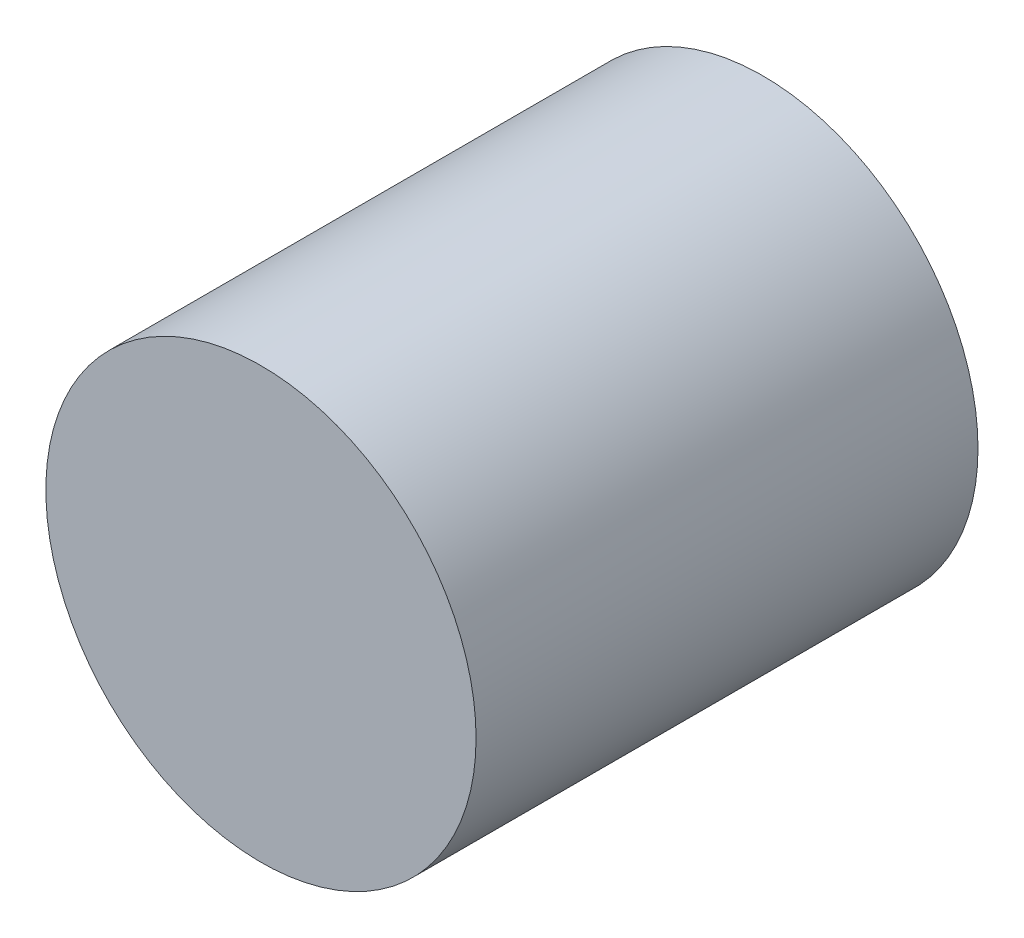
ISO-10303-21;
HEADER;
FILE_DESCRIPTION(('STEP AP214'),'2;1');
FILE_NAME('part.step','',(''),(''),'','','');
FILE_SCHEMA(('AUTOMOTIVE_DESIGN { 1 0 10303 214 1 1 1 1 }'));
ENDSEC;
DATA;
#1=APPLICATION_CONTEXT('core data for automotive mechanical design processes');
#2=APPLICATION_PROTOCOL_DEFINITION('international standard','automotive_design',2000,#1);
#3=PRODUCT_CONTEXT('',#1,'mechanical');
#4=PRODUCT('Part','Part','',(#3));
#5=PRODUCT_RELATED_PRODUCT_CATEGORY('part','',(#4));
#6=PRODUCT_DEFINITION_FORMATION('','',#4);
#7=PRODUCT_DEFINITION_CONTEXT('part definition',#1,'design');
#8=PRODUCT_DEFINITION('design','',#6,#7);
#9=PRODUCT_DEFINITION_SHAPE('','',#8);
#10=(LENGTH_UNIT() NAMED_UNIT(*) SI_UNIT(.MILLI.,.METRE.));
#11=(NAMED_UNIT(*) PLANE_ANGLE_UNIT() SI_UNIT($,.RADIAN.));
#12=(NAMED_UNIT(*) SI_UNIT($,.STERADIAN.) SOLID_ANGLE_UNIT());
#13=UNCERTAINTY_MEASURE_WITH_UNIT(LENGTH_MEASURE(1.E-05),#10,'distance_accuracy_value','');
#14=(GEOMETRIC_REPRESENTATION_CONTEXT(3) GLOBAL_UNCERTAINTY_ASSIGNED_CONTEXT((#13)) GLOBAL_UNIT_ASSIGNED_CONTEXT((#10,
#11,#12)) REPRESENTATION_CONTEXT('',''));
#15=CARTESIAN_POINT('',(0.,0.,0.));
#16=DIRECTION('',(0.,0.,1.));
#17=DIRECTION('',(1.,0.,0.));
#18=AXIS2_PLACEMENT_3D('',#15,#16,#17);
#19=CARTESIAN_POINT('',(0.,0.,35.));
#20=DIRECTION('',(0.,0.,-1.));
#21=DIRECTION('',(-1.,0.,0.));
#22=AXIS2_PLACEMENT_3D('',#19,#20,#21);
#23=CYLINDRICAL_SURFACE('',#22,15.);
#24=CARTESIAN_POINT('',(0.,0.,35.));
#25=DIRECTION('',(0.,0.,1.));
#26=DIRECTION('',(1.,0.,0.));
#27=AXIS2_PLACEMENT_3D('',#24,#25,#26);
#28=CIRCLE('',#27,15.);
#29=CARTESIAN_POINT('',(15.,0.,35.));
#30=VERTEX_POINT('',#29);
#31=EDGE_CURVE('E11',#30,#30,#28,.T.);
#32=ORIENTED_EDGE('',*,*,#31,.F.);
#33=EDGE_LOOP('',(#32));
#34=FACE_BOUND('',#33,.T.);
#35=CARTESIAN_POINT('',(0.,0.,0.));
#36=DIRECTION('',(0.,0.,1.));
#37=DIRECTION('',(1.,0.,0.));
#38=AXIS2_PLACEMENT_3D('',#35,#36,#37);
#39=CIRCLE('',#38,15.);
#40=CARTESIAN_POINT('',(15.,0.,0.));
#41=VERTEX_POINT('',#40);
#42=EDGE_CURVE('E37',#41,#41,#39,.T.);
#43=ORIENTED_EDGE('',*,*,#42,.T.);
#44=EDGE_LOOP('',(#43));
#45=FACE_BOUND('',#44,.T.);
#46=ADVANCED_FACE('F34',(#34,#45),#23,.T.);
#47=CARTESIAN_POINT('',(0.,0.,35.));
#48=DIRECTION('',(0.,0.,1.));
#49=DIRECTION('',(1.,0.,0.));
#50=AXIS2_PLACEMENT_3D('',#47,#48,#49);
#51=PLANE('',#50);
#52=ORIENTED_EDGE('',*,*,#31,.T.);
#53=EDGE_LOOP('',(#52));
#54=FACE_BOUND('',#53,.T.);
#55=ADVANCED_FACE('F118',(#54),#51,.T.);
#56=CARTESIAN_POINT('',(0.,0.,0.));
#57=DIRECTION('',(0.,0.,1.));
#58=DIRECTION('',(1.,0.,0.));
#59=AXIS2_PLACEMENT_3D('',#56,#57,#58);
#60=PLANE('',#59);
#61=DIRECTION('',(1.,0.,0.));
#62=VECTOR('',#61,1.);
#63=CARTESIAN_POINT('',(0.,-7.6,0.));
#64=LINE('',#63,#62);
#65=CARTESIAN_POINT('',(-7.6,-7.6,0.));
#66=VERTEX_POINT('',#65);
#67=CARTESIAN_POINT('',(7.6,-7.6,0.));
#68=VERTEX_POINT('',#67);
#69=EDGE_CURVE('E98',#66,#68,#64,.T.);
#70=ORIENTED_EDGE('',*,*,#69,.T.);
#71=DIRECTION('',(0.,-1.,0.));
#72=VECTOR('',#71,1.);
#73=CARTESIAN_POINT('',(7.6,0.,0.));
#74=LINE('',#73,#72);
#75=CARTESIAN_POINT('',(7.6,7.6,0.));
#76=VERTEX_POINT('',#75);
#77=EDGE_CURVE('E48',#76,#68,#74,.T.);
#78=ORIENTED_EDGE('',*,*,#77,.F.);
#79=DIRECTION('',(1.,0.,0.));
#80=VECTOR('',#79,1.);
#81=CARTESIAN_POINT('',(0.,7.6,0.));
#82=LINE('',#81,#80);
#83=CARTESIAN_POINT('',(-7.6,7.6,0.));
#84=VERTEX_POINT('',#83);
#85=EDGE_CURVE('E104',#84,#76,#82,.T.);
#86=ORIENTED_EDGE('',*,*,#85,.F.);
#87=DIRECTION('',(0.,-1.,0.));
#88=VECTOR('',#87,1.);
#89=CARTESIAN_POINT('',(-7.6,0.,0.));
#90=LINE('',#89,#88);
#91=EDGE_CURVE('E86',#84,#66,#90,.T.);
#92=ORIENTED_EDGE('',*,*,#91,.T.);
#93=EDGE_LOOP('',(#70,#78,#86,#92));
#94=FACE_BOUND('',#93,.T.);
#95=ORIENTED_EDGE('',*,*,#42,.F.);
#96=EDGE_LOOP('',(#95));
#97=FACE_BOUND('',#96,.T.);
#98=ADVANCED_FACE('F115',(#94,#97),#60,.F.);
#99=CARTESIAN_POINT('',(7.6,0.,30.));
#100=DIRECTION('',(1.,0.,0.));
#101=DIRECTION('',(0.,1.,0.));
#102=AXIS2_PLACEMENT_3D('',#99,#100,#101);
#103=PLANE('',#102);
#104=ORIENTED_EDGE('',*,*,#77,.T.);
#105=DIRECTION('',(0.,0.,-1.));
#106=VECTOR('',#105,1.);
#107=CARTESIAN_POINT('',(7.6,-7.6,30.));
#108=LINE('',#107,#106);
#109=CARTESIAN_POINT('',(7.6,-7.6,30.));
#110=VERTEX_POINT('',#109);
#111=EDGE_CURVE('E102',#110,#68,#108,.T.);
#112=ORIENTED_EDGE('',*,*,#111,.F.);
#113=DIRECTION('',(0.,-1.,0.));
#114=VECTOR('',#113,1.);
#115=CARTESIAN_POINT('',(7.6,0.,30.));
#116=LINE('',#115,#114);
#117=CARTESIAN_POINT('',(7.6,7.6,30.));
#118=VERTEX_POINT('',#117);
#119=EDGE_CURVE('E96',#118,#110,#116,.T.);
#120=ORIENTED_EDGE('',*,*,#119,.F.);
#121=DIRECTION('',(0.,0.,-1.));
#122=VECTOR('',#121,1.);
#123=CARTESIAN_POINT('',(7.6,7.6,30.));
#124=LINE('',#123,#122);
#125=EDGE_CURVE('E78',#118,#76,#124,.T.);
#126=ORIENTED_EDGE('',*,*,#125,.T.);
#127=EDGE_LOOP('',(#104,#112,#120,#126));
#128=FACE_BOUND('',#127,.T.);
#129=ADVANCED_FACE('F117',(#128),#103,.F.);
#130=CARTESIAN_POINT('',(0.,7.6,30.));
#131=DIRECTION('',(0.,1.,0.));
#132=DIRECTION('',(0.,0.,1.));
#133=AXIS2_PLACEMENT_3D('',#130,#131,#132);
#134=PLANE('',#133);
#135=ORIENTED_EDGE('',*,*,#85,.T.);
#136=ORIENTED_EDGE('',*,*,#125,.F.);
#137=DIRECTION('',(1.,0.,0.));
#138=VECTOR('',#137,1.);
#139=CARTESIAN_POINT('',(0.,7.6,30.));
#140=LINE('',#139,#138);
#141=CARTESIAN_POINT('',(-7.6,7.6,30.));
#142=VERTEX_POINT('',#141);
#143=EDGE_CURVE('E93',#142,#118,#140,.T.);
#144=ORIENTED_EDGE('',*,*,#143,.F.);
#145=DIRECTION('',(0.,0.,-1.));
#146=VECTOR('',#145,1.);
#147=CARTESIAN_POINT('',(-7.6,7.6,30.));
#148=LINE('',#147,#146);
#149=EDGE_CURVE('E81',#142,#84,#148,.T.);
#150=ORIENTED_EDGE('',*,*,#149,.T.);
#151=EDGE_LOOP('',(#135,#136,#144,#150));
#152=FACE_BOUND('',#151,.T.);
#153=ADVANCED_FACE('F95',(#152),#134,.F.);
#154=CARTESIAN_POINT('',(-7.6,0.,30.));
#155=DIRECTION('',(1.,0.,0.));
#156=DIRECTION('',(0.,1.,0.));
#157=AXIS2_PLACEMENT_3D('',#154,#155,#156);
#158=PLANE('',#157);
#159=ORIENTED_EDGE('',*,*,#91,.F.);
#160=ORIENTED_EDGE('',*,*,#149,.F.);
#161=DIRECTION('',(0.,-1.,0.));
#162=VECTOR('',#161,1.);
#163=CARTESIAN_POINT('',(-7.6,0.,30.));
#164=LINE('',#163,#162);
#165=CARTESIAN_POINT('',(-7.6,-7.6,30.));
#166=VERTEX_POINT('',#165);
#167=EDGE_CURVE('E84',#142,#166,#164,.T.);
#168=ORIENTED_EDGE('',*,*,#167,.T.);
#169=DIRECTION('',(0.,0.,-1.));
#170=VECTOR('',#169,1.);
#171=CARTESIAN_POINT('',(-7.6,-7.6,30.));
#172=LINE('',#171,#170);
#173=EDGE_CURVE('E71',#166,#66,#172,.T.);
#174=ORIENTED_EDGE('',*,*,#173,.T.);
#175=EDGE_LOOP('',(#159,#160,#168,#174));
#176=FACE_BOUND('',#175,.T.);
#177=ADVANCED_FACE('F83',(#176),#158,.T.);
#178=CARTESIAN_POINT('',(0.,-7.6,30.));
#179=DIRECTION('',(0.,1.,0.));
#180=DIRECTION('',(0.,0.,1.));
#181=AXIS2_PLACEMENT_3D('',#178,#179,#180);
#182=PLANE('',#181);
#183=ORIENTED_EDGE('',*,*,#69,.F.);
#184=ORIENTED_EDGE('',*,*,#173,.F.);
#185=DIRECTION('',(1.,0.,0.));
#186=VECTOR('',#185,1.);
#187=CARTESIAN_POINT('',(0.,-7.6,30.));
#188=LINE('',#187,#186);
#189=EDGE_CURVE('E56',#166,#110,#188,.T.);
#190=ORIENTED_EDGE('',*,*,#189,.T.);
#191=ORIENTED_EDGE('',*,*,#111,.T.);
#192=EDGE_LOOP('',(#183,#184,#190,#191));
#193=FACE_BOUND('',#192,.T.);
#194=ADVANCED_FACE('F163',(#193),#182,.T.);
#195=CARTESIAN_POINT('',(0.,0.,30.));
#196=DIRECTION('',(0.,0.,1.));
#197=DIRECTION('',(1.,0.,0.));
#198=AXIS2_PLACEMENT_3D('',#195,#196,#197);
#199=PLANE('',#198);
#200=ORIENTED_EDGE('',*,*,#119,.T.);
#201=ORIENTED_EDGE('',*,*,#189,.F.);
#202=ORIENTED_EDGE('',*,*,#167,.F.);
#203=ORIENTED_EDGE('',*,*,#143,.T.);
#204=EDGE_LOOP('',(#200,#201,#202,#203));
#205=FACE_BOUND('',#204,.T.);
#206=ADVANCED_FACE('F92',(#205),#199,.F.);
#207=CLOSED_SHELL('',(#46,#55,#98,#129,#153,#177,#194,#206));
#208=MANIFOLD_SOLID_BREP('B2',#207);
#209=ADVANCED_BREP_SHAPE_REPRESENTATION('',(#18,#208),#14);
#210=SHAPE_DEFINITION_REPRESENTATION(#9,#209);
ENDSEC;
END-ISO-10303-21;
